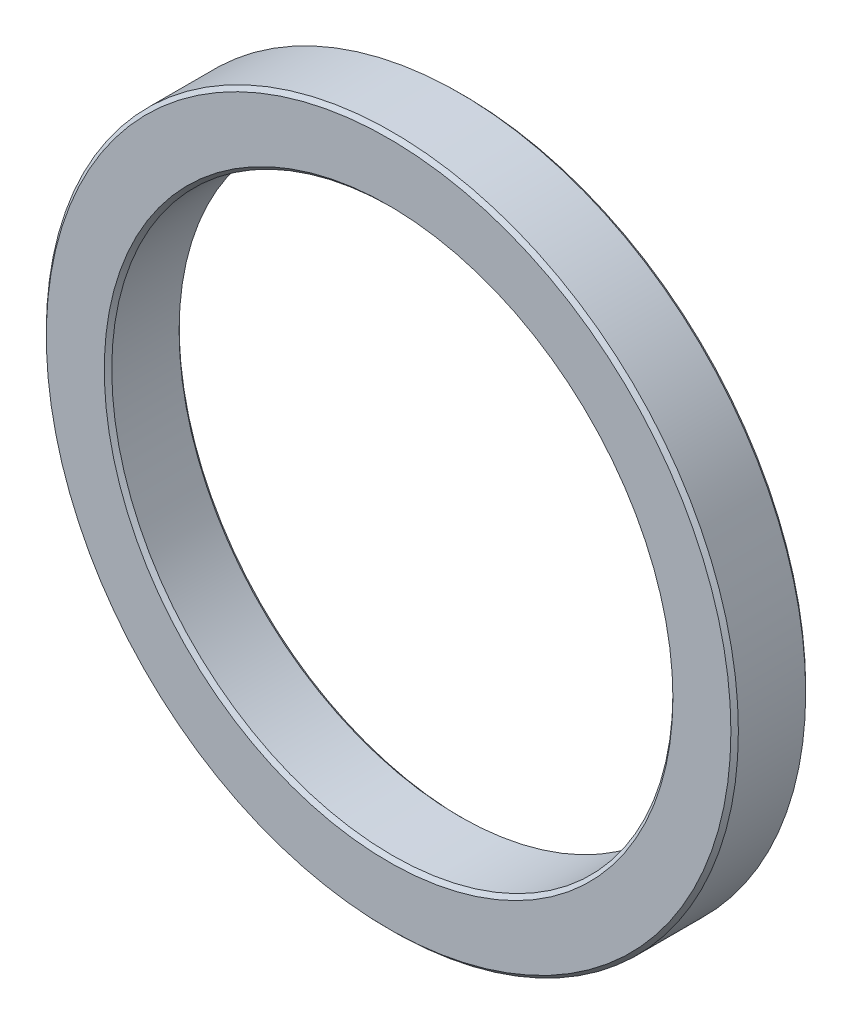
ISO-10303-21;
HEADER;
FILE_DESCRIPTION(('STEP AP214'),'2;1');
FILE_NAME('part.step','',(''),(''),'','','');
FILE_SCHEMA(('AUTOMOTIVE_DESIGN { 1 0 10303 214 1 1 1 1 }'));
ENDSEC;
DATA;
#1=APPLICATION_CONTEXT('core data for automotive mechanical design processes');
#2=APPLICATION_PROTOCOL_DEFINITION('international standard','automotive_design',2000,#1);
#3=PRODUCT_CONTEXT('',#1,'mechanical');
#4=PRODUCT('Part','Part','',(#3));
#5=PRODUCT_RELATED_PRODUCT_CATEGORY('part','',(#4));
#6=PRODUCT_DEFINITION_FORMATION('','',#4);
#7=PRODUCT_DEFINITION_CONTEXT('part definition',#1,'design');
#8=PRODUCT_DEFINITION('design','',#6,#7);
#9=PRODUCT_DEFINITION_SHAPE('','',#8);
#10=(LENGTH_UNIT() NAMED_UNIT(*) SI_UNIT(.MILLI.,.METRE.));
#11=(NAMED_UNIT(*) PLANE_ANGLE_UNIT() SI_UNIT($,.RADIAN.));
#12=(NAMED_UNIT(*) SI_UNIT($,.STERADIAN.) SOLID_ANGLE_UNIT());
#13=UNCERTAINTY_MEASURE_WITH_UNIT(LENGTH_MEASURE(1.E-05),#10,'distance_accuracy_value','');
#14=(GEOMETRIC_REPRESENTATION_CONTEXT(3) GLOBAL_UNCERTAINTY_ASSIGNED_CONTEXT((#13)) GLOBAL_UNIT_ASSIGNED_CONTEXT((#10,
#11,#12)) REPRESENTATION_CONTEXT('',''));
#15=CARTESIAN_POINT('',(0.,0.,0.));
#16=DIRECTION('',(0.,0.,1.));
#17=DIRECTION('',(1.,0.,0.));
#18=AXIS2_PLACEMENT_3D('',#15,#16,#17);
#19=CARTESIAN_POINT('',(0.,0.,4.));
#20=DIRECTION('',(0.,0.,1.));
#21=DIRECTION('',(1.,0.,0.));
#22=AXIS2_PLACEMENT_3D('',#19,#20,#21);
#23=PLANE('',#22);
#24=CARTESIAN_POINT('',(0.,0.,4.));
#25=DIRECTION('',(0.,0.,1.));
#26=DIRECTION('',(1.,0.,0.));
#27=AXIS2_PLACEMENT_3D('',#24,#25,#26);
#28=CIRCLE('',#27,15.2);
#29=CARTESIAN_POINT('',(15.2,0.,4.));
#30=VERTEX_POINT('',#29);
#31=EDGE_CURVE('E10',#30,#30,#28,.F.);
#32=ORIENTED_EDGE('',*,*,#31,.T.);
#33=EDGE_LOOP('',(#32));
#34=FACE_BOUND('',#33,.T.);
#35=CARTESIAN_POINT('',(0.,0.,4.));
#36=DIRECTION('',(0.,0.,1.));
#37=DIRECTION('',(1.,0.,0.));
#38=AXIS2_PLACEMENT_3D('',#35,#36,#37);
#39=CIRCLE('',#38,18.3);
#40=CARTESIAN_POINT('',(18.3,0.,4.));
#41=VERTEX_POINT('',#40);
#42=EDGE_CURVE('E49',#41,#41,#39,.T.);
#43=ORIENTED_EDGE('',*,*,#42,.T.);
#44=EDGE_LOOP('',(#43));
#45=FACE_BOUND('',#44,.T.);
#46=ADVANCED_FACE('F41',(#34,#45),#23,.T.);
#47=CARTESIAN_POINT('',(0.,0.,0.));
#48=DIRECTION('',(0.,0.,1.));
#49=DIRECTION('',(1.,0.,0.));
#50=AXIS2_PLACEMENT_3D('',#47,#48,#49);
#51=PLANE('',#50);
#52=CARTESIAN_POINT('',(0.,0.,0.));
#53=DIRECTION('',(0.,0.,1.));
#54=DIRECTION('',(1.,0.,0.));
#55=AXIS2_PLACEMENT_3D('',#52,#53,#54);
#56=CIRCLE('',#55,15.2);
#57=CARTESIAN_POINT('',(15.2,0.,0.));
#58=VERTEX_POINT('',#57);
#59=EDGE_CURVE('E68',#58,#58,#56,.T.);
#60=ORIENTED_EDGE('',*,*,#59,.T.);
#61=EDGE_LOOP('',(#60));
#62=FACE_BOUND('',#61,.T.);
#63=CARTESIAN_POINT('',(0.,0.,0.));
#64=DIRECTION('',(0.,0.,1.));
#65=DIRECTION('',(1.,0.,0.));
#66=AXIS2_PLACEMENT_3D('',#63,#64,#65);
#67=CIRCLE('',#66,18.3);
#68=CARTESIAN_POINT('',(18.3,0.,0.));
#69=VERTEX_POINT('',#68);
#70=EDGE_CURVE('E71',#69,#69,#67,.F.);
#71=ORIENTED_EDGE('',*,*,#70,.T.);
#72=EDGE_LOOP('',(#71));
#73=FACE_BOUND('',#72,.T.);
#74=ADVANCED_FACE('F75',(#62,#73),#51,.F.);
#75=CARTESIAN_POINT('',(0.,0.,4.));
#76=DIRECTION('',(0.,0.,-1.));
#77=DIRECTION('',(-1.,0.,0.));
#78=AXIS2_PLACEMENT_3D('',#75,#76,#77);
#79=CYLINDRICAL_SURFACE('',#78,18.5);
#80=CARTESIAN_POINT('',(0.,0.,0.199999999999999));
#81=DIRECTION('',(0.,0.,1.));
#82=DIRECTION('',(1.,0.,0.));
#83=AXIS2_PLACEMENT_3D('',#80,#81,#82);
#84=CIRCLE('',#83,18.5);
#85=CARTESIAN_POINT('',(18.5,0.,0.199999999999999));
#86=VERTEX_POINT('',#85);
#87=EDGE_CURVE('E53',#86,#86,#84,.T.);
#88=ORIENTED_EDGE('',*,*,#87,.T.);
#89=EDGE_LOOP('',(#88));
#90=FACE_BOUND('',#89,.T.);
#91=CARTESIAN_POINT('',(0.,0.,3.80000000000003));
#92=DIRECTION('',(0.,0.,1.));
#93=DIRECTION('',(1.,0.,0.));
#94=AXIS2_PLACEMENT_3D('',#91,#92,#93);
#95=CIRCLE('',#94,18.5);
#96=CARTESIAN_POINT('',(18.5,0.,3.80000000000003));
#97=VERTEX_POINT('',#96);
#98=EDGE_CURVE('E57',#97,#97,#95,.F.);
#99=ORIENTED_EDGE('',*,*,#98,.T.);
#100=EDGE_LOOP('',(#99));
#101=FACE_BOUND('',#100,.T.);
#102=ADVANCED_FACE('F85',(#90,#101),#79,.T.);
#103=CARTESIAN_POINT('',(0.,0.,4.));
#104=DIRECTION('',(0.,0.,-1.));
#105=DIRECTION('',(-1.,0.,0.));
#106=AXIS2_PLACEMENT_3D('',#103,#104,#105);
#107=CYLINDRICAL_SURFACE('',#106,15.);
#108=CARTESIAN_POINT('',(0.,0.,0.199999999999997));
#109=DIRECTION('',(0.,0.,1.));
#110=DIRECTION('',(1.,0.,0.));
#111=AXIS2_PLACEMENT_3D('',#108,#109,#110);
#112=CIRCLE('',#111,15.);
#113=CARTESIAN_POINT('',(15.,0.,0.199999999999997));
#114=VERTEX_POINT('',#113);
#115=EDGE_CURVE('E62',#114,#114,#112,.F.);
#116=ORIENTED_EDGE('',*,*,#115,.T.);
#117=EDGE_LOOP('',(#116));
#118=FACE_BOUND('',#117,.T.);
#119=CARTESIAN_POINT('',(0.,0.,3.80000000000001));
#120=DIRECTION('',(0.,0.,1.));
#121=DIRECTION('',(1.,0.,0.));
#122=AXIS2_PLACEMENT_3D('',#119,#120,#121);
#123=CIRCLE('',#122,15.);
#124=CARTESIAN_POINT('',(15.,0.,3.80000000000001));
#125=VERTEX_POINT('',#124);
#126=EDGE_CURVE('E65',#125,#125,#123,.T.);
#127=ORIENTED_EDGE('',*,*,#126,.T.);
#128=EDGE_LOOP('',(#127));
#129=FACE_BOUND('',#128,.T.);
#130=ADVANCED_FACE('F88',(#118,#129),#107,.F.);
#131=CARTESIAN_POINT('',(0.,0.,0.));
#132=DIRECTION('',(0.,0.,-1.));
#133=DIRECTION('',(-1.,0.,0.));
#134=AXIS2_PLACEMENT_3D('',#131,#132,#133);
#135=CONICAL_SURFACE('',#134,15.2,0.78539816339744);
#136=ORIENTED_EDGE('',*,*,#115,.F.);
#137=EDGE_LOOP('',(#136));
#138=FACE_BOUND('',#137,.T.);
#139=ORIENTED_EDGE('',*,*,#59,.F.);
#140=EDGE_LOOP('',(#139));
#141=FACE_BOUND('',#140,.T.);
#142=ADVANCED_FACE('F81',(#138,#141),#135,.F.);
#143=CARTESIAN_POINT('',(0.,0.,0.199999999999999));
#144=DIRECTION('',(0.,0.,1.));
#145=DIRECTION('',(1.,0.,0.));
#146=AXIS2_PLACEMENT_3D('',#143,#144,#145);
#147=CONICAL_SURFACE('',#146,18.5,0.785398163397457);
#148=ORIENTED_EDGE('',*,*,#70,.F.);
#149=EDGE_LOOP('',(#148));
#150=FACE_BOUND('',#149,.T.);
#151=ORIENTED_EDGE('',*,*,#87,.F.);
#152=EDGE_LOOP('',(#151));
#153=FACE_BOUND('',#152,.T.);
#154=ADVANCED_FACE('F77',(#150,#153),#147,.T.);
#155=CARTESIAN_POINT('',(0.,0.,3.80000000000001));
#156=DIRECTION('',(0.,0.,1.));
#157=DIRECTION('',(1.,0.,0.));
#158=AXIS2_PLACEMENT_3D('',#155,#156,#157);
#159=CONICAL_SURFACE('',#158,15.,0.785398163397457);
#160=CARTESIAN_POINT('',(15.2,0.,4.));
#161=CARTESIAN_POINT('',(15.1979166666667,0.,3.99791666666667));
#162=CARTESIAN_POINT('',(15.1958333333333,0.,3.99583333333333));
#163=CARTESIAN_POINT('',(15.1916666666667,0.,3.99166666666667));
#164=CARTESIAN_POINT('',(15.1895833333333,0.,3.98958333333333));
#165=CARTESIAN_POINT('',(15.1854166666667,0.,3.98541666666667));
#166=CARTESIAN_POINT('',(15.1833333333333,0.,3.98333333333333));
#167=CARTESIAN_POINT('',(15.1791666666667,0.,3.97916666666667));
#168=CARTESIAN_POINT('',(15.1770833333333,0.,3.97708333333333));
#169=CARTESIAN_POINT('',(15.1729166666667,0.,3.97291666666667));
#170=CARTESIAN_POINT('',(15.1708333333333,0.,3.97083333333333));
#171=CARTESIAN_POINT('',(15.1666666666667,0.,3.96666666666667));
#172=CARTESIAN_POINT('',(15.1645833333333,0.,3.96458333333333));
#173=CARTESIAN_POINT('',(15.1604166666667,0.,3.96041666666667));
#174=CARTESIAN_POINT('',(15.1583333333333,0.,3.95833333333334));
#175=CARTESIAN_POINT('',(15.1541666666667,0.,3.95416666666667));
#176=CARTESIAN_POINT('',(15.1520833333333,0.,3.95208333333334));
#177=CARTESIAN_POINT('',(15.1479166666667,0.,3.94791666666667));
#178=CARTESIAN_POINT('',(15.1458333333333,0.,3.94583333333334));
#179=CARTESIAN_POINT('',(15.1416666666667,0.,3.94166666666667));
#180=CARTESIAN_POINT('',(15.1395833333333,0.,3.93958333333334));
#181=CARTESIAN_POINT('',(15.1354166666667,0.,3.93541666666667));
#182=CARTESIAN_POINT('',(15.1333333333333,0.,3.93333333333334));
#183=CARTESIAN_POINT('',(15.1291666666667,0.,3.92916666666667));
#184=CARTESIAN_POINT('',(15.1270833333333,0.,3.92708333333334));
#185=CARTESIAN_POINT('',(15.1229166666667,0.,3.92291666666667));
#186=CARTESIAN_POINT('',(15.1208333333333,0.,3.92083333333334));
#187=CARTESIAN_POINT('',(15.1166666666667,0.,3.91666666666667));
#188=CARTESIAN_POINT('',(15.1145833333333,0.,3.91458333333334));
#189=CARTESIAN_POINT('',(15.1104166666667,0.,3.91041666666667));
#190=CARTESIAN_POINT('',(15.1083333333333,0.,3.90833333333334));
#191=CARTESIAN_POINT('',(15.1041666666667,0.,3.90416666666667));
#192=CARTESIAN_POINT('',(15.1020833333333,0.,3.90208333333334));
#193=CARTESIAN_POINT('',(15.0979166666667,0.,3.89791666666667));
#194=CARTESIAN_POINT('',(15.0958333333333,0.,3.89583333333334));
#195=CARTESIAN_POINT('',(15.0916666666667,0.,3.89166666666667));
#196=CARTESIAN_POINT('',(15.0895833333333,0.,3.88958333333334));
#197=CARTESIAN_POINT('',(15.0854166666667,0.,3.88541666666667));
#198=CARTESIAN_POINT('',(15.0833333333333,0.,3.88333333333334));
#199=CARTESIAN_POINT('',(15.0791666666667,0.,3.87916666666667));
#200=CARTESIAN_POINT('',(15.0770833333333,0.,3.87708333333334));
#201=CARTESIAN_POINT('',(15.0729166666667,0.,3.87291666666667));
#202=CARTESIAN_POINT('',(15.0708333333333,0.,3.87083333333334));
#203=CARTESIAN_POINT('',(15.0666666666667,0.,3.86666666666667));
#204=CARTESIAN_POINT('',(15.0645833333333,0.,3.86458333333334));
#205=CARTESIAN_POINT('',(15.0604166666667,0.,3.86041666666667));
#206=CARTESIAN_POINT('',(15.0583333333333,0.,3.85833333333334));
#207=CARTESIAN_POINT('',(15.0541666666667,0.,3.85416666666667));
#208=CARTESIAN_POINT('',(15.0520833333333,0.,3.85208333333334));
#209=CARTESIAN_POINT('',(15.0479166666667,0.,3.84791666666668));
#210=CARTESIAN_POINT('',(15.0458333333333,0.,3.84583333333334));
#211=CARTESIAN_POINT('',(15.0416666666667,0.,3.84166666666668));
#212=CARTESIAN_POINT('',(15.0395833333333,0.,3.83958333333334));
#213=CARTESIAN_POINT('',(15.0354166666667,0.,3.83541666666668));
#214=CARTESIAN_POINT('',(15.0333333333333,0.,3.83333333333334));
#215=CARTESIAN_POINT('',(15.0291666666667,0.,3.82916666666668));
#216=CARTESIAN_POINT('',(15.0270833333333,0.,3.82708333333334));
#217=CARTESIAN_POINT('',(15.0229166666667,0.,3.82291666666668));
#218=CARTESIAN_POINT('',(15.0208333333333,0.,3.82083333333334));
#219=CARTESIAN_POINT('',(15.0166666666667,0.,3.81666666666668));
#220=CARTESIAN_POINT('',(15.0145833333333,0.,3.81458333333334));
#221=CARTESIAN_POINT('',(15.0104166666667,0.,3.81041666666668));
#222=CARTESIAN_POINT('',(15.0083333333333,0.,3.80833333333334));
#223=CARTESIAN_POINT('',(15.0041666666667,0.,3.80416666666668));
#224=CARTESIAN_POINT('',(15.0020833333333,0.,3.80208333333334));
#225=CARTESIAN_POINT('',(15.,0.,3.80000000000001));
#226=B_SPLINE_CURVE_WITH_KNOTS('',3,(#160,#161,#162,#163,#164,#165,#166,#167,#168,#169,#170,
#171,#172,#173,#174,#175,#176,#177,#178,#179,#180,#181,#182,#183,#184,#185,#186,#187,#188,#189,
#190,#191,#192,#193,#194,#195,#196,#197,#198,#199,#200,#201,#202,#203,#204,#205,#206,#207,#208,
#209,#210,#211,#212,#213,#214,#215,#216,#217,#218,#219,#220,#221,#222,#223,#224,#225),
.UNSPECIFIED.,.F.,.F.,(4,2,2,2,2,2,2,2,2,2,2,2,2,2,2,2,2,2,2,2,2,2,2,2,2,2,2,2,2,2,2,2,4),(0.,
0.00883883476483087,0.017677669529663,0.0265165042944944,0.0353553390593253,0.0441941738241562,
0.0530330085889889,0.0618718433538198,0.0707106781186506,0.0795495128834821,0.0883883476483142,
0.0972271824131457,0.106066017177977,0.114904851942807,0.12374368670764,0.132582521472471,
0.141421356237302,0.150260191002133,0.159099025766965,0.167937860531797,0.176776695296628,
0.185615530061459,0.194454364826291,0.203293199591122,0.212132034355953,0.220970869120784,
0.229809703885617,0.238648538650448,0.247487373415279,0.25632620818011,0.265165042944942,
0.274003877709774,0.282842712474604),.UNSPECIFIED.);
#227=EDGE_CURVE('BSEAM80',#30,#125,#226,.T.);
#228=ORIENTED_EDGE('',*,*,#31,.F.);
#229=ORIENTED_EDGE('',*,*,#126,.F.);
#230=ORIENTED_EDGE('',*,*,#227,.T.);
#231=ORIENTED_EDGE('',*,*,#227,.F.);
#232=EDGE_LOOP('',(#228,#230,#229,#231));
#233=FACE_BOUND('',#232,.T.);
#234=ADVANCED_FACE('F80',(#233),#159,.F.);
#235=CARTESIAN_POINT('',(0.,0.,4.));
#236=DIRECTION('',(0.,0.,-1.));
#237=DIRECTION('',(-1.,0.,0.));
#238=AXIS2_PLACEMENT_3D('',#235,#236,#237);
#239=CONICAL_SURFACE('',#238,18.3,0.785398163397431);
#240=ORIENTED_EDGE('',*,*,#98,.F.);
#241=EDGE_LOOP('',(#240));
#242=FACE_BOUND('',#241,.T.);
#243=ORIENTED_EDGE('',*,*,#42,.F.);
#244=EDGE_LOOP('',(#243));
#245=FACE_BOUND('',#244,.T.);
#246=ADVANCED_FACE('F44',(#242,#245),#239,.T.);
#247=CLOSED_SHELL('',(#46,#74,#102,#130,#142,#154,#234,#246));
#248=MANIFOLD_SOLID_BREP('B2',#247);
#249=ADVANCED_BREP_SHAPE_REPRESENTATION('',(#18,#248),#14);
#250=SHAPE_DEFINITION_REPRESENTATION(#9,#249);
ENDSEC;
END-ISO-10303-21;
